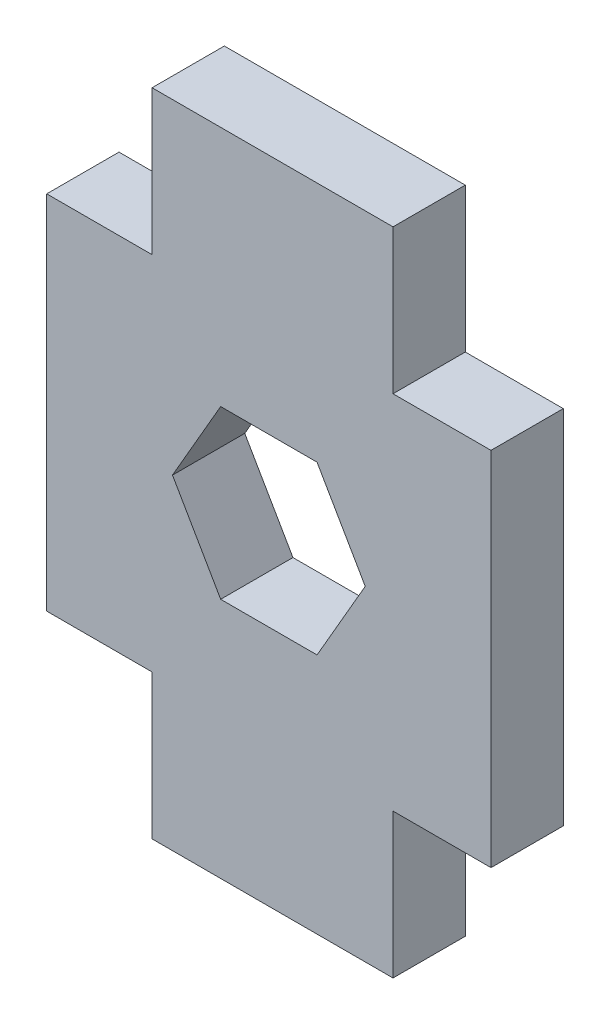
ISO-10303-21;
HEADER;
FILE_DESCRIPTION(('STEP AP214'),'2;1');
FILE_NAME('part.step','',(''),(''),'','','');
FILE_SCHEMA(('AUTOMOTIVE_DESIGN { 1 0 10303 214 1 1 1 1 }'));
ENDSEC;
DATA;
#1=APPLICATION_CONTEXT('core data for automotive mechanical design processes');
#2=APPLICATION_PROTOCOL_DEFINITION('international standard','automotive_design',2000,#1);
#3=PRODUCT_CONTEXT('',#1,'mechanical');
#4=PRODUCT('Part','Part','',(#3));
#5=PRODUCT_RELATED_PRODUCT_CATEGORY('part','',(#4));
#6=PRODUCT_DEFINITION_FORMATION('','',#4);
#7=PRODUCT_DEFINITION_CONTEXT('part definition',#1,'design');
#8=PRODUCT_DEFINITION('design','',#6,#7);
#9=PRODUCT_DEFINITION_SHAPE('','',#8);
#10=(LENGTH_UNIT() NAMED_UNIT(*) SI_UNIT(.MILLI.,.METRE.));
#11=(NAMED_UNIT(*) PLANE_ANGLE_UNIT() SI_UNIT($,.RADIAN.));
#12=(NAMED_UNIT(*) SI_UNIT($,.STERADIAN.) SOLID_ANGLE_UNIT());
#13=UNCERTAINTY_MEASURE_WITH_UNIT(LENGTH_MEASURE(1.E-05),#10,'distance_accuracy_value','');
#14=(GEOMETRIC_REPRESENTATION_CONTEXT(3) GLOBAL_UNCERTAINTY_ASSIGNED_CONTEXT((#13)) GLOBAL_UNIT_ASSIGNED_CONTEXT((#10,
#11,#12)) REPRESENTATION_CONTEXT('',''));
#15=CARTESIAN_POINT('',(0.,0.,0.));
#16=DIRECTION('',(0.,0.,1.));
#17=DIRECTION('',(1.,0.,0.));
#18=AXIS2_PLACEMENT_3D('',#15,#16,#17);
#19=CARTESIAN_POINT('',(0.,0.,6.));
#20=DIRECTION('',(0.,0.,-1.));
#21=DIRECTION('',(-1.,0.,0.));
#22=AXIS2_PLACEMENT_3D('',#19,#20,#21);
#23=PLANE('',#22);
#24=DIRECTION('',(0.,1.,0.));
#25=VECTOR('',#24,1.);
#26=CARTESIAN_POINT('',(-182.683627049338,-113.262954902338,6.));
#27=LINE('',#26,#25);
#28=CARTESIAN_POINT('',(-182.683627049338,-119.262954902338,6.));
#29=VERTEX_POINT('',#28);
#30=CARTESIAN_POINT('',(-182.683627049338,-107.262954902338,6.));
#31=VERTEX_POINT('',#30);
#32=EDGE_CURVE('E213',#29,#31,#27,.T.);
#33=ORIENTED_EDGE('',*,*,#32,.T.);
#34=DIRECTION('',(1.,0.,0.));
#35=VECTOR('',#34,1.);
#36=CARTESIAN_POINT('',(-182.683627049338,-107.262954902338,6.));
#37=LINE('',#36,#35);
#38=CARTESIAN_POINT('',(-174.549373807979,-107.262954902338,6.));
#39=VERTEX_POINT('',#38);
#40=EDGE_CURVE('E216',#31,#39,#37,.T.);
#41=ORIENTED_EDGE('',*,*,#40,.T.);
#42=DIRECTION('',(0.,1.,0.));
#43=VECTOR('',#42,1.);
#44=CARTESIAN_POINT('',(-174.549373807979,-77.2629549023382,6.));
#45=LINE('',#44,#43);
#46=CARTESIAN_POINT('',(-174.549373807979,-77.2629549023382,6.));
#47=VERTEX_POINT('',#46);
#48=EDGE_CURVE('E219',#39,#47,#45,.T.);
#49=ORIENTED_EDGE('',*,*,#48,.T.);
#50=DIRECTION('',(-1.,0.,0.));
#51=VECTOR('',#50,1.);
#52=CARTESIAN_POINT('',(-182.683627049338,-77.2629549023382,6.));
#53=LINE('',#52,#51);
#54=CARTESIAN_POINT('',(-182.683627049338,-77.2629549023382,6.));
#55=VERTEX_POINT('',#54);
#56=EDGE_CURVE('E221',#47,#55,#53,.T.);
#57=ORIENTED_EDGE('',*,*,#56,.T.);
#58=DIRECTION('',(0.,1.,0.));
#59=VECTOR('',#58,1.);
#60=CARTESIAN_POINT('',(-182.683627049338,-71.2629549023382,6.));
#61=LINE('',#60,#59);
#62=CARTESIAN_POINT('',(-182.683627049338,-65.2629549023382,6.));
#63=VERTEX_POINT('',#62);
#64=EDGE_CURVE('E223',#55,#63,#61,.T.);
#65=ORIENTED_EDGE('',*,*,#64,.T.);
#66=DIRECTION('',(-1.,0.,0.));
#67=VECTOR('',#66,1.);
#68=CARTESIAN_POINT('',(-202.683627049338,-65.2629549023382,6.));
#69=LINE('',#68,#67);
#70=CARTESIAN_POINT('',(-202.683627049338,-65.2629549023382,6.));
#71=VERTEX_POINT('',#70);
#72=EDGE_CURVE('E225',#63,#71,#69,.T.);
#73=ORIENTED_EDGE('',*,*,#72,.T.);
#74=DIRECTION('',(0.,-1.,0.));
#75=VECTOR('',#74,1.);
#76=CARTESIAN_POINT('',(-202.683627049338,-71.2629549023382,6.));
#77=LINE('',#76,#75);
#78=CARTESIAN_POINT('',(-202.683627049338,-77.2629549023382,6.));
#79=VERTEX_POINT('',#78);
#80=EDGE_CURVE('E227',#71,#79,#77,.T.);
#81=ORIENTED_EDGE('',*,*,#80,.T.);
#82=DIRECTION('',(-1.,0.,0.));
#83=VECTOR('',#82,1.);
#84=CARTESIAN_POINT('',(-211.428617247897,-77.2629549023382,6.));
#85=LINE('',#84,#83);
#86=CARTESIAN_POINT('',(-211.428617247897,-77.2629549023382,6.));
#87=VERTEX_POINT('',#86);
#88=EDGE_CURVE('E229',#79,#87,#85,.T.);
#89=ORIENTED_EDGE('',*,*,#88,.T.);
#90=DIRECTION('',(0.,-1.,0.));
#91=VECTOR('',#90,1.);
#92=CARTESIAN_POINT('',(-211.428617247897,-77.2629549023382,6.));
#93=LINE('',#92,#91);
#94=CARTESIAN_POINT('',(-211.428617247897,-107.262954902338,6.));
#95=VERTEX_POINT('',#94);
#96=EDGE_CURVE('E231',#87,#95,#93,.T.);
#97=ORIENTED_EDGE('',*,*,#96,.T.);
#98=DIRECTION('',(1.,0.,0.));
#99=VECTOR('',#98,1.);
#100=CARTESIAN_POINT('',(-211.428617247897,-107.262954902338,6.));
#101=LINE('',#100,#99);
#102=CARTESIAN_POINT('',(-202.683627049338,-107.262954902338,6.));
#103=VERTEX_POINT('',#102);
#104=EDGE_CURVE('E233',#95,#103,#101,.T.);
#105=ORIENTED_EDGE('',*,*,#104,.T.);
#106=DIRECTION('',(0.,-1.,0.));
#107=VECTOR('',#106,1.);
#108=CARTESIAN_POINT('',(-202.683627049338,-113.262954902338,6.));
#109=LINE('',#108,#107);
#110=CARTESIAN_POINT('',(-202.683627049338,-119.262954902338,6.));
#111=VERTEX_POINT('',#110);
#112=EDGE_CURVE('E235',#103,#111,#109,.T.);
#113=ORIENTED_EDGE('',*,*,#112,.T.);
#114=DIRECTION('',(1.,0.,0.));
#115=VECTOR('',#114,1.);
#116=CARTESIAN_POINT('',(-202.683627049338,-119.262954902338,6.));
#117=LINE('',#116,#115);
#118=EDGE_CURVE('E237',#111,#29,#117,.T.);
#119=ORIENTED_EDGE('',*,*,#118,.T.);
#120=EDGE_LOOP('',(#33,#41,#49,#57,#65,#73,#81,#89,#97,#105,#113,#119));
#121=FACE_BOUND('',#120,.T.);
#122=DIRECTION('',(0.499999999999999,0.866025403784439,0.));
#123=VECTOR('',#122,1.);
#124=CARTESIAN_POINT('',(-188.988995527938,-99.1911581326137,6.));
#125=LINE('',#124,#123);
#126=CARTESIAN_POINT('',(-188.988995527938,-99.1911581326137,6.));
#127=VERTEX_POINT('',#126);
#128=CARTESIAN_POINT('',(-184.988995527938,-92.2629549023382,6.));
#129=VERTEX_POINT('',#128);
#130=EDGE_CURVE('E162',#127,#129,#125,.T.);
#131=ORIENTED_EDGE('',*,*,#130,.F.);
#132=DIRECTION('',(1.,0.,0.));
#133=VECTOR('',#132,1.);
#134=CARTESIAN_POINT('',(-196.988995527938,-99.1911581326137,6.));
#135=LINE('',#134,#133);
#136=CARTESIAN_POINT('',(-196.988995527938,-99.1911581326137,6.));
#137=VERTEX_POINT('',#136);
#138=EDGE_CURVE('E191',#137,#127,#135,.T.);
#139=ORIENTED_EDGE('',*,*,#138,.F.);
#140=DIRECTION('',(0.500000000000001,-0.866025403784438,0.));
#141=VECTOR('',#140,1.);
#142=CARTESIAN_POINT('',(-200.988995527938,-92.2629549023382,6.));
#143=LINE('',#142,#141);
#144=CARTESIAN_POINT('',(-200.988995527938,-92.2629549023382,6.));
#145=VERTEX_POINT('',#144);
#146=EDGE_CURVE('E189',#145,#137,#143,.T.);
#147=ORIENTED_EDGE('',*,*,#146,.F.);
#148=DIRECTION('',(-0.499999999999999,-0.866025403784439,0.));
#149=VECTOR('',#148,1.);
#150=CARTESIAN_POINT('',(-196.988995527938,-85.3347516720627,6.));
#151=LINE('',#150,#149);
#152=CARTESIAN_POINT('',(-196.988995527938,-85.3347516720627,6.));
#153=VERTEX_POINT('',#152);
#154=EDGE_CURVE('E185',#153,#145,#151,.T.);
#155=ORIENTED_EDGE('',*,*,#154,.F.);
#156=DIRECTION('',(-1.,0.,0.));
#157=VECTOR('',#156,1.);
#158=CARTESIAN_POINT('',(-188.988995527938,-85.3347516720627,6.));
#159=LINE('',#158,#157);
#160=CARTESIAN_POINT('',(-188.988995527938,-85.3347516720627,6.));
#161=VERTEX_POINT('',#160);
#162=EDGE_CURVE('E183',#161,#153,#159,.T.);
#163=ORIENTED_EDGE('',*,*,#162,.F.);
#164=DIRECTION('',(-0.5,0.866025403784438,0.));
#165=VECTOR('',#164,1.);
#166=CARTESIAN_POINT('',(-184.988995527938,-92.2629549023382,6.));
#167=LINE('',#166,#165);
#168=EDGE_CURVE('E170',#129,#161,#167,.T.);
#169=ORIENTED_EDGE('',*,*,#168,.F.);
#170=EDGE_LOOP('',(#131,#139,#147,#155,#163,#169));
#171=FACE_BOUND('',#170,.T.);
#172=ADVANCED_FACE('F37',(#121,#171),#23,.F.);
#173=CARTESIAN_POINT('',(0.,0.,0.));
#174=DIRECTION('',(0.,0.,-1.));
#175=DIRECTION('',(-1.,0.,0.));
#176=AXIS2_PLACEMENT_3D('',#173,#174,#175);
#177=PLANE('',#176);
#178=DIRECTION('',(1.,0.,0.));
#179=VECTOR('',#178,1.);
#180=CARTESIAN_POINT('',(-182.683627049338,-107.262954902338,0.));
#181=LINE('',#180,#179);
#182=CARTESIAN_POINT('',(-182.683627049338,-107.262954902338,0.));
#183=VERTEX_POINT('',#182);
#184=CARTESIAN_POINT('',(-174.549373807979,-107.262954902338,0.));
#185=VERTEX_POINT('',#184);
#186=EDGE_CURVE('E178',#183,#185,#181,.T.);
#187=ORIENTED_EDGE('',*,*,#186,.F.);
#188=DIRECTION('',(0.,1.,0.));
#189=VECTOR('',#188,1.);
#190=CARTESIAN_POINT('',(-182.683627049338,-113.262954902338,0.));
#191=LINE('',#190,#189);
#192=CARTESIAN_POINT('',(-182.683627049338,-119.262954902338,0.));
#193=VERTEX_POINT('',#192);
#194=EDGE_CURVE('E217',#193,#183,#191,.T.);
#195=ORIENTED_EDGE('',*,*,#194,.F.);
#196=DIRECTION('',(1.,0.,0.));
#197=VECTOR('',#196,1.);
#198=CARTESIAN_POINT('',(-202.683627049338,-119.262954902338,0.));
#199=LINE('',#198,#197);
#200=CARTESIAN_POINT('',(-202.683627049338,-119.262954902338,0.));
#201=VERTEX_POINT('',#200);
#202=EDGE_CURVE('E263',#201,#193,#199,.T.);
#203=ORIENTED_EDGE('',*,*,#202,.F.);
#204=DIRECTION('',(0.,-1.,0.));
#205=VECTOR('',#204,1.);
#206=CARTESIAN_POINT('',(-202.683627049338,-113.262954902338,0.));
#207=LINE('',#206,#205);
#208=CARTESIAN_POINT('',(-202.683627049338,-107.262954902338,0.));
#209=VERTEX_POINT('',#208);
#210=EDGE_CURVE('E261',#209,#201,#207,.T.);
#211=ORIENTED_EDGE('',*,*,#210,.F.);
#212=DIRECTION('',(1.,0.,0.));
#213=VECTOR('',#212,1.);
#214=CARTESIAN_POINT('',(-211.428617247897,-107.262954902338,0.));
#215=LINE('',#214,#213);
#216=CARTESIAN_POINT('',(-211.428617247897,-107.262954902338,0.));
#217=VERTEX_POINT('',#216);
#218=EDGE_CURVE('E258',#217,#209,#215,.T.);
#219=ORIENTED_EDGE('',*,*,#218,.F.);
#220=DIRECTION('',(0.,-1.,0.));
#221=VECTOR('',#220,1.);
#222=CARTESIAN_POINT('',(-211.428617247897,-77.2629549023382,0.));
#223=LINE('',#222,#221);
#224=CARTESIAN_POINT('',(-211.428617247897,-77.2629549023382,0.));
#225=VERTEX_POINT('',#224);
#226=EDGE_CURVE('E256',#225,#217,#223,.T.);
#227=ORIENTED_EDGE('',*,*,#226,.F.);
#228=DIRECTION('',(-1.,0.,0.));
#229=VECTOR('',#228,1.);
#230=CARTESIAN_POINT('',(-211.428617247897,-77.2629549023382,0.));
#231=LINE('',#230,#229);
#232=CARTESIAN_POINT('',(-202.683627049338,-77.2629549023382,0.));
#233=VERTEX_POINT('',#232);
#234=EDGE_CURVE('E254',#233,#225,#231,.T.);
#235=ORIENTED_EDGE('',*,*,#234,.F.);
#236=DIRECTION('',(0.,-1.,0.));
#237=VECTOR('',#236,1.);
#238=CARTESIAN_POINT('',(-202.683627049338,-71.2629549023382,0.));
#239=LINE('',#238,#237);
#240=CARTESIAN_POINT('',(-202.683627049338,-65.2629549023382,0.));
#241=VERTEX_POINT('',#240);
#242=EDGE_CURVE('E252',#241,#233,#239,.T.);
#243=ORIENTED_EDGE('',*,*,#242,.F.);
#244=DIRECTION('',(-1.,0.,0.));
#245=VECTOR('',#244,1.);
#246=CARTESIAN_POINT('',(-202.683627049338,-65.2629549023382,0.));
#247=LINE('',#246,#245);
#248=CARTESIAN_POINT('',(-182.683627049338,-65.2629549023382,0.));
#249=VERTEX_POINT('',#248);
#250=EDGE_CURVE('E249',#249,#241,#247,.T.);
#251=ORIENTED_EDGE('',*,*,#250,.F.);
#252=DIRECTION('',(0.,1.,0.));
#253=VECTOR('',#252,1.);
#254=CARTESIAN_POINT('',(-182.683627049338,-71.2629549023382,0.));
#255=LINE('',#254,#253);
#256=CARTESIAN_POINT('',(-182.683627049338,-77.2629549023382,0.));
#257=VERTEX_POINT('',#256);
#258=EDGE_CURVE('E247',#257,#249,#255,.T.);
#259=ORIENTED_EDGE('',*,*,#258,.F.);
#260=DIRECTION('',(-1.,0.,0.));
#261=VECTOR('',#260,1.);
#262=CARTESIAN_POINT('',(-182.683627049338,-77.2629549023382,0.));
#263=LINE('',#262,#261);
#264=CARTESIAN_POINT('',(-174.549373807979,-77.2629549023382,0.));
#265=VERTEX_POINT('',#264);
#266=EDGE_CURVE('E244',#265,#257,#263,.T.);
#267=ORIENTED_EDGE('',*,*,#266,.F.);
#268=DIRECTION('',(0.,1.,0.));
#269=VECTOR('',#268,1.);
#270=CARTESIAN_POINT('',(-174.549373807979,-77.2629549023382,0.));
#271=LINE('',#270,#269);
#272=EDGE_CURVE('E242',#185,#265,#271,.T.);
#273=ORIENTED_EDGE('',*,*,#272,.F.);
#274=EDGE_LOOP('',(#187,#195,#203,#211,#219,#227,#235,#243,#251,#259,#267,#273));
#275=FACE_BOUND('',#274,.T.);
#276=DIRECTION('',(1.,0.,0.));
#277=VECTOR('',#276,1.);
#278=CARTESIAN_POINT('',(-196.988995527938,-99.1911581326137,0.));
#279=LINE('',#278,#277);
#280=CARTESIAN_POINT('',(-196.988995527938,-99.1911581326137,0.));
#281=VERTEX_POINT('',#280);
#282=CARTESIAN_POINT('',(-188.988995527938,-99.1911581326137,0.));
#283=VERTEX_POINT('',#282);
#284=EDGE_CURVE('E171',#281,#283,#279,.T.);
#285=ORIENTED_EDGE('',*,*,#284,.T.);
#286=DIRECTION('',(0.499999999999999,0.866025403784439,0.));
#287=VECTOR('',#286,1.);
#288=CARTESIAN_POINT('',(-188.988995527938,-99.1911581326137,0.));
#289=LINE('',#288,#287);
#290=CARTESIAN_POINT('',(-184.988995527938,-92.2629549023382,0.));
#291=VERTEX_POINT('',#290);
#292=EDGE_CURVE('E60',#283,#291,#289,.T.);
#293=ORIENTED_EDGE('',*,*,#292,.T.);
#294=DIRECTION('',(-0.5,0.866025403784438,0.));
#295=VECTOR('',#294,1.);
#296=CARTESIAN_POINT('',(-184.988995527938,-92.2629549023382,0.));
#297=LINE('',#296,#295);
#298=CARTESIAN_POINT('',(-188.988995527938,-85.3347516720627,0.));
#299=VERTEX_POINT('',#298);
#300=EDGE_CURVE('E177',#291,#299,#297,.T.);
#301=ORIENTED_EDGE('',*,*,#300,.T.);
#302=DIRECTION('',(-1.,0.,0.));
#303=VECTOR('',#302,1.);
#304=CARTESIAN_POINT('',(-188.988995527938,-85.3347516720627,0.));
#305=LINE('',#304,#303);
#306=CARTESIAN_POINT('',(-196.988995527938,-85.3347516720627,0.));
#307=VERTEX_POINT('',#306);
#308=EDGE_CURVE('E195',#299,#307,#305,.T.);
#309=ORIENTED_EDGE('',*,*,#308,.T.);
#310=DIRECTION('',(-0.499999999999999,-0.866025403784439,0.));
#311=VECTOR('',#310,1.);
#312=CARTESIAN_POINT('',(-196.988995527938,-85.3347516720627,0.));
#313=LINE('',#312,#311);
#314=CARTESIAN_POINT('',(-200.988995527938,-92.2629549023382,0.));
#315=VERTEX_POINT('',#314);
#316=EDGE_CURVE('E198',#307,#315,#313,.T.);
#317=ORIENTED_EDGE('',*,*,#316,.T.);
#318=DIRECTION('',(0.500000000000001,-0.866025403784438,0.));
#319=VECTOR('',#318,1.);
#320=CARTESIAN_POINT('',(-200.988995527938,-92.2629549023382,0.));
#321=LINE('',#320,#319);
#322=EDGE_CURVE('E201',#315,#281,#321,.T.);
#323=ORIENTED_EDGE('',*,*,#322,.T.);
#324=EDGE_LOOP('',(#285,#293,#301,#309,#317,#323));
#325=FACE_BOUND('',#324,.T.);
#326=ADVANCED_FACE('F305',(#275,#325),#177,.T.);
#327=CARTESIAN_POINT('',(-182.683627049338,-107.262954902338,6.));
#328=DIRECTION('',(0.,1.,0.));
#329=DIRECTION('',(0.,0.,1.));
#330=AXIS2_PLACEMENT_3D('',#327,#328,#329);
#331=PLANE('',#330);
#332=ORIENTED_EDGE('',*,*,#186,.T.);
#333=DIRECTION('',(0.,0.,-1.));
#334=VECTOR('',#333,1.);
#335=CARTESIAN_POINT('',(-174.549373807979,-107.262954902338,6.));
#336=LINE('',#335,#334);
#337=EDGE_CURVE('E45',#39,#185,#336,.T.);
#338=ORIENTED_EDGE('',*,*,#337,.F.);
#339=ORIENTED_EDGE('',*,*,#40,.F.);
#340=DIRECTION('',(0.,0.,-1.));
#341=VECTOR('',#340,1.);
#342=CARTESIAN_POINT('',(-182.683627049338,-107.262954902338,6.));
#343=LINE('',#342,#341);
#344=EDGE_CURVE('E11',#31,#183,#343,.T.);
#345=ORIENTED_EDGE('',*,*,#344,.T.);
#346=EDGE_LOOP('',(#332,#338,#339,#345));
#347=FACE_BOUND('',#346,.T.);
#348=ADVANCED_FACE('F39',(#347),#331,.F.);
#349=CARTESIAN_POINT('',(-174.549373807979,-77.2629549023382,6.));
#350=DIRECTION('',(-1.,0.,0.));
#351=DIRECTION('',(0.,0.,1.));
#352=AXIS2_PLACEMENT_3D('',#349,#350,#351);
#353=PLANE('',#352);
#354=ORIENTED_EDGE('',*,*,#272,.T.);
#355=DIRECTION('',(0.,0.,-1.));
#356=VECTOR('',#355,1.);
#357=CARTESIAN_POINT('',(-174.549373807979,-77.2629549023382,6.));
#358=LINE('',#357,#356);
#359=EDGE_CURVE('E292',#47,#265,#358,.T.);
#360=ORIENTED_EDGE('',*,*,#359,.F.);
#361=ORIENTED_EDGE('',*,*,#48,.F.);
#362=ORIENTED_EDGE('',*,*,#337,.T.);
#363=EDGE_LOOP('',(#354,#360,#361,#362));
#364=FACE_BOUND('',#363,.T.);
#365=ADVANCED_FACE('F299',(#364),#353,.F.);
#366=CARTESIAN_POINT('',(-182.683627049338,-77.2629549023382,6.));
#367=DIRECTION('',(0.,-1.,0.));
#368=DIRECTION('',(0.,0.,-1.));
#369=AXIS2_PLACEMENT_3D('',#366,#367,#368);
#370=PLANE('',#369);
#371=ORIENTED_EDGE('',*,*,#266,.T.);
#372=DIRECTION('',(0.,0.,-1.));
#373=VECTOR('',#372,1.);
#374=CARTESIAN_POINT('',(-182.683627049338,-77.2629549023382,6.));
#375=LINE('',#374,#373);
#376=EDGE_CURVE('E289',#55,#257,#375,.T.);
#377=ORIENTED_EDGE('',*,*,#376,.F.);
#378=ORIENTED_EDGE('',*,*,#56,.F.);
#379=ORIENTED_EDGE('',*,*,#359,.T.);
#380=EDGE_LOOP('',(#371,#377,#378,#379));
#381=FACE_BOUND('',#380,.T.);
#382=ADVANCED_FACE('F311',(#381),#370,.F.);
#383=CARTESIAN_POINT('',(-182.683627049338,-71.2629549023382,6.));
#384=DIRECTION('',(-1.,0.,0.));
#385=DIRECTION('',(0.,0.,1.));
#386=AXIS2_PLACEMENT_3D('',#383,#384,#385);
#387=PLANE('',#386);
#388=ORIENTED_EDGE('',*,*,#258,.T.);
#389=DIRECTION('',(0.,0.,-1.));
#390=VECTOR('',#389,1.);
#391=CARTESIAN_POINT('',(-182.683627049338,-65.2629549023382,6.));
#392=LINE('',#391,#390);
#393=EDGE_CURVE('E286',#63,#249,#392,.T.);
#394=ORIENTED_EDGE('',*,*,#393,.F.);
#395=ORIENTED_EDGE('',*,*,#64,.F.);
#396=ORIENTED_EDGE('',*,*,#376,.T.);
#397=EDGE_LOOP('',(#388,#394,#395,#396));
#398=FACE_BOUND('',#397,.T.);
#399=ADVANCED_FACE('F315',(#398),#387,.F.);
#400=CARTESIAN_POINT('',(-202.683627049338,-65.2629549023382,6.));
#401=DIRECTION('',(0.,-1.,0.));
#402=DIRECTION('',(0.,0.,-1.));
#403=AXIS2_PLACEMENT_3D('',#400,#401,#402);
#404=PLANE('',#403);
#405=ORIENTED_EDGE('',*,*,#250,.T.);
#406=DIRECTION('',(0.,0.,-1.));
#407=VECTOR('',#406,1.);
#408=CARTESIAN_POINT('',(-202.683627049338,-65.2629549023382,6.));
#409=LINE('',#408,#407);
#410=EDGE_CURVE('E283',#71,#241,#409,.T.);
#411=ORIENTED_EDGE('',*,*,#410,.F.);
#412=ORIENTED_EDGE('',*,*,#72,.F.);
#413=ORIENTED_EDGE('',*,*,#393,.T.);
#414=EDGE_LOOP('',(#405,#411,#412,#413));
#415=FACE_BOUND('',#414,.T.);
#416=ADVANCED_FACE('F352',(#415),#404,.F.);
#417=CARTESIAN_POINT('',(-202.683627049338,-71.2629549023382,6.));
#418=DIRECTION('',(1.,0.,0.));
#419=DIRECTION('',(0.,0.,-1.));
#420=AXIS2_PLACEMENT_3D('',#417,#418,#419);
#421=PLANE('',#420);
#422=ORIENTED_EDGE('',*,*,#242,.T.);
#423=DIRECTION('',(0.,0.,-1.));
#424=VECTOR('',#423,1.);
#425=CARTESIAN_POINT('',(-202.683627049338,-77.2629549023382,6.));
#426=LINE('',#425,#424);
#427=EDGE_CURVE('E280',#79,#233,#426,.T.);
#428=ORIENTED_EDGE('',*,*,#427,.F.);
#429=ORIENTED_EDGE('',*,*,#80,.F.);
#430=ORIENTED_EDGE('',*,*,#410,.T.);
#431=EDGE_LOOP('',(#422,#428,#429,#430));
#432=FACE_BOUND('',#431,.T.);
#433=ADVANCED_FACE('F350',(#432),#421,.F.);
#434=CARTESIAN_POINT('',(-211.428617247897,-77.2629549023382,6.));
#435=DIRECTION('',(0.,-1.,0.));
#436=DIRECTION('',(0.,0.,-1.));
#437=AXIS2_PLACEMENT_3D('',#434,#435,#436);
#438=PLANE('',#437);
#439=ORIENTED_EDGE('',*,*,#234,.T.);
#440=DIRECTION('',(0.,0.,-1.));
#441=VECTOR('',#440,1.);
#442=CARTESIAN_POINT('',(-211.428617247897,-77.2629549023382,6.));
#443=LINE('',#442,#441);
#444=EDGE_CURVE('E277',#87,#225,#443,.T.);
#445=ORIENTED_EDGE('',*,*,#444,.F.);
#446=ORIENTED_EDGE('',*,*,#88,.F.);
#447=ORIENTED_EDGE('',*,*,#427,.T.);
#448=EDGE_LOOP('',(#439,#445,#446,#447));
#449=FACE_BOUND('',#448,.T.);
#450=ADVANCED_FACE('F346',(#449),#438,.F.);
#451=CARTESIAN_POINT('',(-211.428617247897,-77.2629549023382,6.));
#452=DIRECTION('',(1.,0.,0.));
#453=DIRECTION('',(0.,0.,-1.));
#454=AXIS2_PLACEMENT_3D('',#451,#452,#453);
#455=PLANE('',#454);
#456=ORIENTED_EDGE('',*,*,#226,.T.);
#457=DIRECTION('',(0.,0.,-1.));
#458=VECTOR('',#457,1.);
#459=CARTESIAN_POINT('',(-211.428617247897,-107.262954902338,6.));
#460=LINE('',#459,#458);
#461=EDGE_CURVE('E274',#95,#217,#460,.T.);
#462=ORIENTED_EDGE('',*,*,#461,.F.);
#463=ORIENTED_EDGE('',*,*,#96,.F.);
#464=ORIENTED_EDGE('',*,*,#444,.T.);
#465=EDGE_LOOP('',(#456,#462,#463,#464));
#466=FACE_BOUND('',#465,.T.);
#467=ADVANCED_FACE('F341',(#466),#455,.F.);
#468=CARTESIAN_POINT('',(-211.428617247897,-107.262954902338,6.));
#469=DIRECTION('',(0.,1.,0.));
#470=DIRECTION('',(0.,0.,1.));
#471=AXIS2_PLACEMENT_3D('',#468,#469,#470);
#472=PLANE('',#471);
#473=ORIENTED_EDGE('',*,*,#218,.T.);
#474=DIRECTION('',(0.,0.,-1.));
#475=VECTOR('',#474,1.);
#476=CARTESIAN_POINT('',(-202.683627049338,-107.262954902338,6.));
#477=LINE('',#476,#475);
#478=EDGE_CURVE('E271',#103,#209,#477,.T.);
#479=ORIENTED_EDGE('',*,*,#478,.F.);
#480=ORIENTED_EDGE('',*,*,#104,.F.);
#481=ORIENTED_EDGE('',*,*,#461,.T.);
#482=EDGE_LOOP('',(#473,#479,#480,#481));
#483=FACE_BOUND('',#482,.T.);
#484=ADVANCED_FACE('F336',(#483),#472,.F.);
#485=CARTESIAN_POINT('',(-202.683627049338,-113.262954902338,6.));
#486=DIRECTION('',(1.,0.,0.));
#487=DIRECTION('',(0.,0.,-1.));
#488=AXIS2_PLACEMENT_3D('',#485,#486,#487);
#489=PLANE('',#488);
#490=ORIENTED_EDGE('',*,*,#210,.T.);
#491=DIRECTION('',(0.,0.,-1.));
#492=VECTOR('',#491,1.);
#493=CARTESIAN_POINT('',(-202.683627049338,-119.262954902338,6.));
#494=LINE('',#493,#492);
#495=EDGE_CURVE('E268',#111,#201,#494,.T.);
#496=ORIENTED_EDGE('',*,*,#495,.F.);
#497=ORIENTED_EDGE('',*,*,#112,.F.);
#498=ORIENTED_EDGE('',*,*,#478,.T.);
#499=EDGE_LOOP('',(#490,#496,#497,#498));
#500=FACE_BOUND('',#499,.T.);
#501=ADVANCED_FACE('F332',(#500),#489,.F.);
#502=CARTESIAN_POINT('',(-202.683627049338,-119.262954902338,6.));
#503=DIRECTION('',(0.,1.,0.));
#504=DIRECTION('',(0.,0.,1.));
#505=AXIS2_PLACEMENT_3D('',#502,#503,#504);
#506=PLANE('',#505);
#507=ORIENTED_EDGE('',*,*,#202,.T.);
#508=DIRECTION('',(0.,0.,-1.));
#509=VECTOR('',#508,1.);
#510=CARTESIAN_POINT('',(-182.683627049338,-119.262954902338,6.));
#511=LINE('',#510,#509);
#512=EDGE_CURVE('E240',#29,#193,#511,.T.);
#513=ORIENTED_EDGE('',*,*,#512,.F.);
#514=ORIENTED_EDGE('',*,*,#118,.F.);
#515=ORIENTED_EDGE('',*,*,#495,.T.);
#516=EDGE_LOOP('',(#507,#513,#514,#515));
#517=FACE_BOUND('',#516,.T.);
#518=ADVANCED_FACE('F327',(#517),#506,.F.);
#519=CARTESIAN_POINT('',(-182.683627049338,-113.262954902338,6.));
#520=DIRECTION('',(-1.,0.,0.));
#521=DIRECTION('',(0.,0.,1.));
#522=AXIS2_PLACEMENT_3D('',#519,#520,#521);
#523=PLANE('',#522);
#524=ORIENTED_EDGE('',*,*,#194,.T.);
#525=ORIENTED_EDGE('',*,*,#344,.F.);
#526=ORIENTED_EDGE('',*,*,#32,.F.);
#527=ORIENTED_EDGE('',*,*,#512,.T.);
#528=EDGE_LOOP('',(#524,#525,#526,#527));
#529=FACE_BOUND('',#528,.T.);
#530=ADVANCED_FACE('F322',(#529),#523,.F.);
#531=CARTESIAN_POINT('',(-188.988995527938,-99.1911581326137,6.));
#532=DIRECTION('',(-0.866025403784439,0.499999999999999,0.));
#533=DIRECTION('',(-0.499999999999999,-0.866025403784439,0.));
#534=AXIS2_PLACEMENT_3D('',#531,#532,#533);
#535=PLANE('',#534);
#536=ORIENTED_EDGE('',*,*,#292,.F.);
#537=DIRECTION('',(0.,0.,-1.));
#538=VECTOR('',#537,1.);
#539=CARTESIAN_POINT('',(-188.988995527938,-99.1911581326137,6.));
#540=LINE('',#539,#538);
#541=EDGE_CURVE('E166',#127,#283,#540,.T.);
#542=ORIENTED_EDGE('',*,*,#541,.F.);
#543=ORIENTED_EDGE('',*,*,#130,.T.);
#544=DIRECTION('',(0.,0.,-1.));
#545=VECTOR('',#544,1.);
#546=CARTESIAN_POINT('',(-184.988995527938,-92.2629549023382,6.));
#547=LINE('',#546,#545);
#548=EDGE_CURVE('E165',#129,#291,#547,.T.);
#549=ORIENTED_EDGE('',*,*,#548,.T.);
#550=EDGE_LOOP('',(#536,#542,#543,#549));
#551=FACE_BOUND('',#550,.T.);
#552=ADVANCED_FACE('F164',(#551),#535,.T.);
#553=CARTESIAN_POINT('',(-184.988995527938,-92.2629549023382,6.));
#554=DIRECTION('',(-0.866025403784438,-0.500000000000001,0.));
#555=DIRECTION('',(0.500000000000001,-0.866025403784438,0.));
#556=AXIS2_PLACEMENT_3D('',#553,#554,#555);
#557=PLANE('',#556);
#558=ORIENTED_EDGE('',*,*,#300,.F.);
#559=ORIENTED_EDGE('',*,*,#548,.F.);
#560=ORIENTED_EDGE('',*,*,#168,.T.);
#561=DIRECTION('',(0.,0.,-1.));
#562=VECTOR('',#561,1.);
#563=CARTESIAN_POINT('',(-188.988995527938,-85.3347516720627,6.));
#564=LINE('',#563,#562);
#565=EDGE_CURVE('E179',#161,#299,#564,.T.);
#566=ORIENTED_EDGE('',*,*,#565,.T.);
#567=EDGE_LOOP('',(#558,#559,#560,#566));
#568=FACE_BOUND('',#567,.T.);
#569=ADVANCED_FACE('F174',(#568),#557,.T.);
#570=CARTESIAN_POINT('',(-188.988995527938,-85.3347516720627,6.));
#571=DIRECTION('',(0.,-1.,0.));
#572=DIRECTION('',(0.,0.,-1.));
#573=AXIS2_PLACEMENT_3D('',#570,#571,#572);
#574=PLANE('',#573);
#575=ORIENTED_EDGE('',*,*,#308,.F.);
#576=ORIENTED_EDGE('',*,*,#565,.F.);
#577=ORIENTED_EDGE('',*,*,#162,.T.);
#578=DIRECTION('',(0.,0.,-1.));
#579=VECTOR('',#578,1.);
#580=CARTESIAN_POINT('',(-196.988995527938,-85.3347516720627,6.));
#581=LINE('',#580,#579);
#582=EDGE_CURVE('E210',#153,#307,#581,.T.);
#583=ORIENTED_EDGE('',*,*,#582,.T.);
#584=EDGE_LOOP('',(#575,#576,#577,#583));
#585=FACE_BOUND('',#584,.T.);
#586=ADVANCED_FACE('F416',(#585),#574,.T.);
#587=CARTESIAN_POINT('',(-196.988995527938,-85.3347516720627,6.));
#588=DIRECTION('',(0.866025403784439,-0.499999999999999,0.));
#589=DIRECTION('',(0.499999999999999,0.866025403784439,0.));
#590=AXIS2_PLACEMENT_3D('',#587,#588,#589);
#591=PLANE('',#590);
#592=ORIENTED_EDGE('',*,*,#316,.F.);
#593=ORIENTED_EDGE('',*,*,#582,.F.);
#594=ORIENTED_EDGE('',*,*,#154,.T.);
#595=DIRECTION('',(0.,0.,-1.));
#596=VECTOR('',#595,1.);
#597=CARTESIAN_POINT('',(-200.988995527938,-92.2629549023382,6.));
#598=LINE('',#597,#596);
#599=EDGE_CURVE('E208',#145,#315,#598,.T.);
#600=ORIENTED_EDGE('',*,*,#599,.T.);
#601=EDGE_LOOP('',(#592,#593,#594,#600));
#602=FACE_BOUND('',#601,.T.);
#603=ADVANCED_FACE('F422',(#602),#591,.T.);
#604=CARTESIAN_POINT('',(-200.988995527938,-92.2629549023382,6.));
#605=DIRECTION('',(0.866025403784438,0.500000000000001,0.));
#606=DIRECTION('',(-0.500000000000001,0.866025403784438,0.));
#607=AXIS2_PLACEMENT_3D('',#604,#605,#606);
#608=PLANE('',#607);
#609=ORIENTED_EDGE('',*,*,#322,.F.);
#610=ORIENTED_EDGE('',*,*,#599,.F.);
#611=ORIENTED_EDGE('',*,*,#146,.T.);
#612=DIRECTION('',(0.,0.,-1.));
#613=VECTOR('',#612,1.);
#614=CARTESIAN_POINT('',(-196.988995527938,-99.1911581326137,6.));
#615=LINE('',#614,#613);
#616=EDGE_CURVE('E52',#137,#281,#615,.T.);
#617=ORIENTED_EDGE('',*,*,#616,.T.);
#618=EDGE_LOOP('',(#609,#610,#611,#617));
#619=FACE_BOUND('',#618,.T.);
#620=ADVANCED_FACE('F430',(#619),#608,.T.);
#621=CARTESIAN_POINT('',(-196.988995527938,-99.1911581326137,6.));
#622=DIRECTION('',(0.,1.,0.));
#623=DIRECTION('',(0.,0.,1.));
#624=AXIS2_PLACEMENT_3D('',#621,#622,#623);
#625=PLANE('',#624);
#626=ORIENTED_EDGE('',*,*,#284,.F.);
#627=ORIENTED_EDGE('',*,*,#616,.F.);
#628=ORIENTED_EDGE('',*,*,#138,.T.);
#629=ORIENTED_EDGE('',*,*,#541,.T.);
#630=EDGE_LOOP('',(#626,#627,#628,#629));
#631=FACE_BOUND('',#630,.T.);
#632=ADVANCED_FACE('F438',(#631),#625,.T.);
#633=CLOSED_SHELL('',(#172,#326,#348,#365,#382,#399,#416,#433,#450,#467,#484,#501,#518,#530,
#552,#569,#586,#603,#620,#632));
#634=MANIFOLD_SOLID_BREP('B2',#633);
#635=ADVANCED_BREP_SHAPE_REPRESENTATION('',(#18,#634),#14);
#636=SHAPE_DEFINITION_REPRESENTATION(#9,#635);
ENDSEC;
END-ISO-10303-21;
